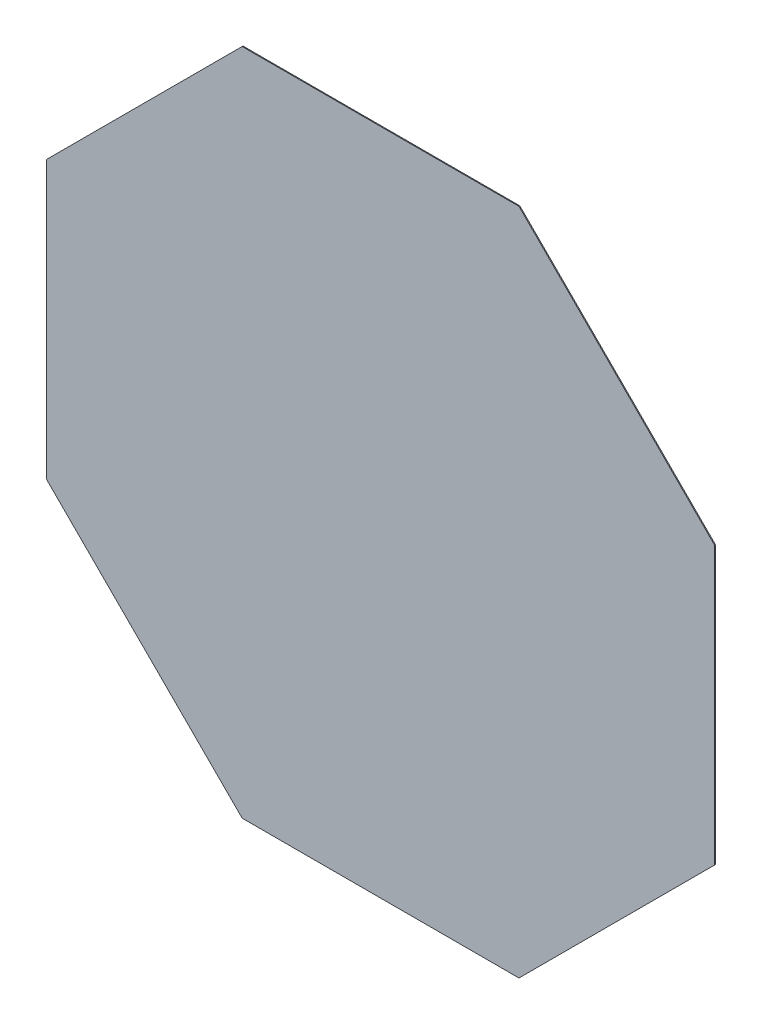
ISO-10303-21;
HEADER;
FILE_DESCRIPTION(('STEP AP214'),'2;1');
FILE_NAME('part.step','',(''),(''),'','','');
FILE_SCHEMA(('AUTOMOTIVE_DESIGN { 1 0 10303 214 1 1 1 1 }'));
ENDSEC;
DATA;
#1=APPLICATION_CONTEXT('core data for automotive mechanical design processes');
#2=APPLICATION_PROTOCOL_DEFINITION('international standard','automotive_design',2000,#1);
#3=PRODUCT_CONTEXT('',#1,'mechanical');
#4=PRODUCT('Part','Part','',(#3));
#5=PRODUCT_RELATED_PRODUCT_CATEGORY('part','',(#4));
#6=PRODUCT_DEFINITION_FORMATION('','',#4);
#7=PRODUCT_DEFINITION_CONTEXT('part definition',#1,'design');
#8=PRODUCT_DEFINITION('design','',#6,#7);
#9=PRODUCT_DEFINITION_SHAPE('','',#8);
#10=(LENGTH_UNIT() NAMED_UNIT(*) SI_UNIT(.MILLI.,.METRE.));
#11=(NAMED_UNIT(*) PLANE_ANGLE_UNIT() SI_UNIT($,.RADIAN.));
#12=(NAMED_UNIT(*) SI_UNIT($,.STERADIAN.) SOLID_ANGLE_UNIT());
#13=UNCERTAINTY_MEASURE_WITH_UNIT(LENGTH_MEASURE(1.E-05),#10,'distance_accuracy_value','');
#14=(GEOMETRIC_REPRESENTATION_CONTEXT(3) GLOBAL_UNCERTAINTY_ASSIGNED_CONTEXT((#13)) GLOBAL_UNIT_ASSIGNED_CONTEXT((#10,
#11,#12)) REPRESENTATION_CONTEXT('',''));
#15=CARTESIAN_POINT('',(0.,0.,0.));
#16=DIRECTION('',(0.,0.,1.));
#17=DIRECTION('',(1.,0.,0.));
#18=AXIS2_PLACEMENT_3D('',#15,#16,#17);
#19=CARTESIAN_POINT('',(25.0000000000001,-10.3553390593273,0.065));
#20=DIRECTION('',(-1.,0.,0.));
#21=DIRECTION('',(0.,-1.,0.));
#22=AXIS2_PLACEMENT_3D('',#19,#20,#21);
#23=PLANE('',#22);
#24=DIRECTION('',(0.,1.,0.));
#25=VECTOR('',#24,1.);
#26=CARTESIAN_POINT('',(25.0000000000001,-10.3553390593273,0.));
#27=LINE('',#26,#25);
#28=CARTESIAN_POINT('',(25.0000000000001,-10.3553390593273,0.));
#29=VERTEX_POINT('',#28);
#30=CARTESIAN_POINT('',(25.,10.3553390593275,0.));
#31=VERTEX_POINT('',#30);
#32=EDGE_CURVE('E129',#29,#31,#27,.T.);
#33=ORIENTED_EDGE('',*,*,#32,.T.);
#34=DIRECTION('',(0.,0.,-1.));
#35=VECTOR('',#34,1.);
#36=CARTESIAN_POINT('',(25.,10.3553390593275,0.065));
#37=LINE('',#36,#35);
#38=CARTESIAN_POINT('',(25.,10.3553390593275,0.065));
#39=VERTEX_POINT('',#38);
#40=EDGE_CURVE('E11',#39,#31,#37,.T.);
#41=ORIENTED_EDGE('',*,*,#40,.F.);
#42=DIRECTION('',(0.,1.,0.));
#43=VECTOR('',#42,1.);
#44=CARTESIAN_POINT('',(25.0000000000001,-10.3553390593273,0.065));
#45=LINE('',#44,#43);
#46=CARTESIAN_POINT('',(25.0000000000001,-10.3553390593273,0.065));
#47=VERTEX_POINT('',#46);
#48=EDGE_CURVE('E143',#47,#39,#45,.T.);
#49=ORIENTED_EDGE('',*,*,#48,.F.);
#50=DIRECTION('',(0.,0.,-1.));
#51=VECTOR('',#50,1.);
#52=CARTESIAN_POINT('',(25.0000000000001,-10.3553390593273,0.065));
#53=LINE('',#52,#51);
#54=EDGE_CURVE('E125',#47,#29,#53,.T.);
#55=ORIENTED_EDGE('',*,*,#54,.T.);
#56=EDGE_LOOP('',(#33,#41,#49,#55));
#57=FACE_BOUND('',#56,.T.);
#58=ADVANCED_FACE('F33',(#57),#23,.F.);
#59=CARTESIAN_POINT('',(25.,10.3553390593275,0.065));
#60=DIRECTION('',(-0.707106781186545,-0.70710678118655,0.));
#61=DIRECTION('',(0.70710678118655,-0.707106781186545,0.));
#62=AXIS2_PLACEMENT_3D('',#59,#60,#61);
#63=PLANE('',#62);
#64=DIRECTION('',(-0.70710678118655,0.707106781186545,0.));
#65=VECTOR('',#64,1.);
#66=CARTESIAN_POINT('',(25.,10.3553390593275,0.));
#67=LINE('',#66,#65);
#68=CARTESIAN_POINT('',(10.3553390593273,25.0000000000001,0.));
#69=VERTEX_POINT('',#68);
#70=EDGE_CURVE('E132',#31,#69,#67,.T.);
#71=ORIENTED_EDGE('',*,*,#70,.T.);
#72=DIRECTION('',(0.,0.,-1.));
#73=VECTOR('',#72,1.);
#74=CARTESIAN_POINT('',(10.3553390593273,25.0000000000001,0.065));
#75=LINE('',#74,#73);
#76=CARTESIAN_POINT('',(10.3553390593273,25.0000000000001,0.065));
#77=VERTEX_POINT('',#76);
#78=EDGE_CURVE('E41',#77,#69,#75,.T.);
#79=ORIENTED_EDGE('',*,*,#78,.F.);
#80=DIRECTION('',(-0.70710678118655,0.707106781186545,0.));
#81=VECTOR('',#80,1.);
#82=CARTESIAN_POINT('',(25.,10.3553390593275,0.065));
#83=LINE('',#82,#81);
#84=EDGE_CURVE('E92',#39,#77,#83,.T.);
#85=ORIENTED_EDGE('',*,*,#84,.F.);
#86=ORIENTED_EDGE('',*,*,#40,.T.);
#87=EDGE_LOOP('',(#71,#79,#85,#86));
#88=FACE_BOUND('',#87,.T.);
#89=ADVANCED_FACE('F178',(#88),#63,.F.);
#90=CARTESIAN_POINT('',(10.3553390593273,25.0000000000001,0.065));
#91=DIRECTION('',(0.,-1.,0.));
#92=DIRECTION('',(1.,0.,0.));
#93=AXIS2_PLACEMENT_3D('',#90,#91,#92);
#94=PLANE('',#93);
#95=DIRECTION('',(-1.,0.,0.));
#96=VECTOR('',#95,1.);
#97=CARTESIAN_POINT('',(10.3553390593273,25.0000000000001,0.));
#98=LINE('',#97,#96);
#99=CARTESIAN_POINT('',(-10.3553390593275,25.,0.));
#100=VERTEX_POINT('',#99);
#101=EDGE_CURVE('E134',#69,#100,#98,.T.);
#102=ORIENTED_EDGE('',*,*,#101,.T.);
#103=DIRECTION('',(0.,0.,-1.));
#104=VECTOR('',#103,1.);
#105=CARTESIAN_POINT('',(-10.3553390593275,25.,0.065));
#106=LINE('',#105,#104);
#107=CARTESIAN_POINT('',(-10.3553390593275,25.,0.065));
#108=VERTEX_POINT('',#107);
#109=EDGE_CURVE('E150',#108,#100,#106,.T.);
#110=ORIENTED_EDGE('',*,*,#109,.F.);
#111=DIRECTION('',(-1.,0.,0.));
#112=VECTOR('',#111,1.);
#113=CARTESIAN_POINT('',(10.3553390593273,25.0000000000001,0.065));
#114=LINE('',#113,#112);
#115=EDGE_CURVE('E158',#77,#108,#114,.T.);
#116=ORIENTED_EDGE('',*,*,#115,.F.);
#117=ORIENTED_EDGE('',*,*,#78,.T.);
#118=EDGE_LOOP('',(#102,#110,#116,#117));
#119=FACE_BOUND('',#118,.T.);
#120=ADVANCED_FACE('F156',(#119),#94,.F.);
#121=CARTESIAN_POINT('',(-10.3553390593275,25.,0.065));
#122=DIRECTION('',(0.70710678118655,-0.707106781186545,0.));
#123=DIRECTION('',(0.707106781186545,0.70710678118655,0.));
#124=AXIS2_PLACEMENT_3D('',#121,#122,#123);
#125=PLANE('',#124);
#126=DIRECTION('',(-0.707106781186545,-0.70710678118655,0.));
#127=VECTOR('',#126,1.);
#128=CARTESIAN_POINT('',(-10.3553390593275,25.,0.));
#129=LINE('',#128,#127);
#130=CARTESIAN_POINT('',(-25.,10.3553390593273,0.));
#131=VERTEX_POINT('',#130);
#132=EDGE_CURVE('E136',#100,#131,#129,.T.);
#133=ORIENTED_EDGE('',*,*,#132,.T.);
#134=DIRECTION('',(0.,0.,-1.));
#135=VECTOR('',#134,1.);
#136=CARTESIAN_POINT('',(-25.,10.3553390593273,0.065));
#137=LINE('',#136,#135);
#138=CARTESIAN_POINT('',(-25.,10.3553390593273,0.065));
#139=VERTEX_POINT('',#138);
#140=EDGE_CURVE('E147',#139,#131,#137,.T.);
#141=ORIENTED_EDGE('',*,*,#140,.F.);
#142=DIRECTION('',(-0.707106781186545,-0.70710678118655,0.));
#143=VECTOR('',#142,1.);
#144=CARTESIAN_POINT('',(-10.3553390593275,25.,0.065));
#145=LINE('',#144,#143);
#146=EDGE_CURVE('E170',#108,#139,#145,.T.);
#147=ORIENTED_EDGE('',*,*,#146,.F.);
#148=ORIENTED_EDGE('',*,*,#109,.T.);
#149=EDGE_LOOP('',(#133,#141,#147,#148));
#150=FACE_BOUND('',#149,.T.);
#151=ADVANCED_FACE('F166',(#150),#125,.F.);
#152=CARTESIAN_POINT('',(-25.,10.3553390593273,0.065));
#153=DIRECTION('',(1.,0.,0.));
#154=DIRECTION('',(0.,1.,0.));
#155=AXIS2_PLACEMENT_3D('',#152,#153,#154);
#156=PLANE('',#155);
#157=DIRECTION('',(0.,-1.,0.));
#158=VECTOR('',#157,1.);
#159=CARTESIAN_POINT('',(-25.,10.3553390593273,0.));
#160=LINE('',#159,#158);
#161=CARTESIAN_POINT('',(-25.,-10.3553390593275,0.));
#162=VERTEX_POINT('',#161);
#163=EDGE_CURVE('E138',#131,#162,#160,.T.);
#164=ORIENTED_EDGE('',*,*,#163,.T.);
#165=DIRECTION('',(0.,0.,-1.));
#166=VECTOR('',#165,1.);
#167=CARTESIAN_POINT('',(-25.,-10.3553390593275,0.065));
#168=LINE('',#167,#166);
#169=CARTESIAN_POINT('',(-25.,-10.3553390593275,0.065));
#170=VERTEX_POINT('',#169);
#171=EDGE_CURVE('E120',#170,#162,#168,.T.);
#172=ORIENTED_EDGE('',*,*,#171,.F.);
#173=DIRECTION('',(0.,-1.,0.));
#174=VECTOR('',#173,1.);
#175=CARTESIAN_POINT('',(-25.,10.3553390593273,0.065));
#176=LINE('',#175,#174);
#177=EDGE_CURVE('E111',#139,#170,#176,.T.);
#178=ORIENTED_EDGE('',*,*,#177,.F.);
#179=ORIENTED_EDGE('',*,*,#140,.T.);
#180=EDGE_LOOP('',(#164,#172,#178,#179));
#181=FACE_BOUND('',#180,.T.);
#182=ADVANCED_FACE('F169',(#181),#156,.F.);
#183=CARTESIAN_POINT('',(-25.,-10.3553390593275,0.065));
#184=DIRECTION('',(0.707106781186545,0.70710678118655,0.));
#185=DIRECTION('',(-0.70710678118655,0.707106781186545,0.));
#186=AXIS2_PLACEMENT_3D('',#183,#184,#185);
#187=PLANE('',#186);
#188=DIRECTION('',(0.70710678118655,-0.707106781186545,0.));
#189=VECTOR('',#188,1.);
#190=CARTESIAN_POINT('',(-25.,-10.3553390593275,0.));
#191=LINE('',#190,#189);
#192=CARTESIAN_POINT('',(-10.3553390593273,-25.,0.));
#193=VERTEX_POINT('',#192);
#194=EDGE_CURVE('E119',#162,#193,#191,.T.);
#195=ORIENTED_EDGE('',*,*,#194,.T.);
#196=DIRECTION('',(0.,0.,-1.));
#197=VECTOR('',#196,1.);
#198=CARTESIAN_POINT('',(-10.3553390593273,-25.,0.065));
#199=LINE('',#198,#197);
#200=CARTESIAN_POINT('',(-10.3553390593273,-25.,0.065));
#201=VERTEX_POINT('',#200);
#202=EDGE_CURVE('E116',#201,#193,#199,.T.);
#203=ORIENTED_EDGE('',*,*,#202,.F.);
#204=DIRECTION('',(0.70710678118655,-0.707106781186545,0.));
#205=VECTOR('',#204,1.);
#206=CARTESIAN_POINT('',(-25.,-10.3553390593275,0.065));
#207=LINE('',#206,#205);
#208=EDGE_CURVE('E105',#170,#201,#207,.T.);
#209=ORIENTED_EDGE('',*,*,#208,.F.);
#210=ORIENTED_EDGE('',*,*,#171,.T.);
#211=EDGE_LOOP('',(#195,#203,#209,#210));
#212=FACE_BOUND('',#211,.T.);
#213=ADVANCED_FACE('F117',(#212),#187,.F.);
#214=CARTESIAN_POINT('',(-10.3553390593273,-25.,0.065));
#215=DIRECTION('',(0.,1.,0.));
#216=DIRECTION('',(-1.,0.,0.));
#217=AXIS2_PLACEMENT_3D('',#214,#215,#216);
#218=PLANE('',#217);
#219=DIRECTION('',(1.,0.,0.));
#220=VECTOR('',#219,1.);
#221=CARTESIAN_POINT('',(-10.3553390593273,-25.,0.));
#222=LINE('',#221,#220);
#223=CARTESIAN_POINT('',(10.3553390593275,-25.,0.));
#224=VERTEX_POINT('',#223);
#225=EDGE_CURVE('E78',#193,#224,#222,.T.);
#226=ORIENTED_EDGE('',*,*,#225,.T.);
#227=DIRECTION('',(0.,0.,-1.));
#228=VECTOR('',#227,1.);
#229=CARTESIAN_POINT('',(10.3553390593275,-25.,0.065));
#230=LINE('',#229,#228);
#231=CARTESIAN_POINT('',(10.3553390593275,-25.,0.065));
#232=VERTEX_POINT('',#231);
#233=EDGE_CURVE('E121',#232,#224,#230,.T.);
#234=ORIENTED_EDGE('',*,*,#233,.F.);
#235=DIRECTION('',(1.,0.,0.));
#236=VECTOR('',#235,1.);
#237=CARTESIAN_POINT('',(-10.3553390593273,-25.,0.065));
#238=LINE('',#237,#236);
#239=EDGE_CURVE('E109',#201,#232,#238,.T.);
#240=ORIENTED_EDGE('',*,*,#239,.F.);
#241=ORIENTED_EDGE('',*,*,#202,.T.);
#242=EDGE_LOOP('',(#226,#234,#240,#241));
#243=FACE_BOUND('',#242,.T.);
#244=ADVANCED_FACE('F123',(#243),#218,.F.);
#245=CARTESIAN_POINT('',(10.3553390593275,-25.,0.065));
#246=DIRECTION('',(-0.70710678118655,0.707106781186545,0.));
#247=DIRECTION('',(-0.707106781186545,-0.70710678118655,0.));
#248=AXIS2_PLACEMENT_3D('',#245,#246,#247);
#249=PLANE('',#248);
#250=DIRECTION('',(0.707106781186545,0.70710678118655,0.));
#251=VECTOR('',#250,1.);
#252=CARTESIAN_POINT('',(10.3553390593275,-25.,0.));
#253=LINE('',#252,#251);
#254=EDGE_CURVE('E84',#224,#29,#253,.T.);
#255=ORIENTED_EDGE('',*,*,#254,.T.);
#256=ORIENTED_EDGE('',*,*,#54,.F.);
#257=DIRECTION('',(0.707106781186545,0.70710678118655,0.));
#258=VECTOR('',#257,1.);
#259=CARTESIAN_POINT('',(10.3553390593275,-25.,0.065));
#260=LINE('',#259,#258);
#261=EDGE_CURVE('E49',#232,#47,#260,.T.);
#262=ORIENTED_EDGE('',*,*,#261,.F.);
#263=ORIENTED_EDGE('',*,*,#233,.T.);
#264=EDGE_LOOP('',(#255,#256,#262,#263));
#265=FACE_BOUND('',#264,.T.);
#266=ADVANCED_FACE('F194',(#265),#249,.F.);
#267=CARTESIAN_POINT('',(0.,0.,0.065));
#268=DIRECTION('',(0.,0.,1.));
#269=DIRECTION('',(1.,0.,0.));
#270=AXIS2_PLACEMENT_3D('',#267,#268,#269);
#271=PLANE('',#270);
#272=ORIENTED_EDGE('',*,*,#48,.T.);
#273=ORIENTED_EDGE('',*,*,#84,.T.);
#274=ORIENTED_EDGE('',*,*,#115,.T.);
#275=ORIENTED_EDGE('',*,*,#146,.T.);
#276=ORIENTED_EDGE('',*,*,#177,.T.);
#277=ORIENTED_EDGE('',*,*,#208,.T.);
#278=ORIENTED_EDGE('',*,*,#239,.T.);
#279=ORIENTED_EDGE('',*,*,#261,.T.);
#280=EDGE_LOOP('',(#272,#273,#274,#275,#276,#277,#278,#279));
#281=FACE_BOUND('',#280,.T.);
#282=ADVANCED_FACE('F107',(#281),#271,.T.);
#283=CARTESIAN_POINT('',(0.,0.,0.));
#284=DIRECTION('',(0.,0.,1.));
#285=DIRECTION('',(1.,0.,0.));
#286=AXIS2_PLACEMENT_3D('',#283,#284,#285);
#287=PLANE('',#286);
#288=ORIENTED_EDGE('',*,*,#32,.F.);
#289=ORIENTED_EDGE('',*,*,#254,.F.);
#290=ORIENTED_EDGE('',*,*,#225,.F.);
#291=ORIENTED_EDGE('',*,*,#194,.F.);
#292=ORIENTED_EDGE('',*,*,#163,.F.);
#293=ORIENTED_EDGE('',*,*,#132,.F.);
#294=ORIENTED_EDGE('',*,*,#101,.F.);
#295=ORIENTED_EDGE('',*,*,#70,.F.);
#296=EDGE_LOOP('',(#288,#289,#290,#291,#292,#293,#294,#295));
#297=FACE_BOUND('',#296,.T.);
#298=ADVANCED_FACE('F162',(#297),#287,.F.);
#299=CLOSED_SHELL('',(#58,#89,#120,#151,#182,#213,#244,#266,#282,#298));
#300=MANIFOLD_SOLID_BREP('B2',#299);
#301=ADVANCED_BREP_SHAPE_REPRESENTATION('',(#18,#300),#14);
#302=SHAPE_DEFINITION_REPRESENTATION(#9,#301);
ENDSEC;
END-ISO-10303-21;
